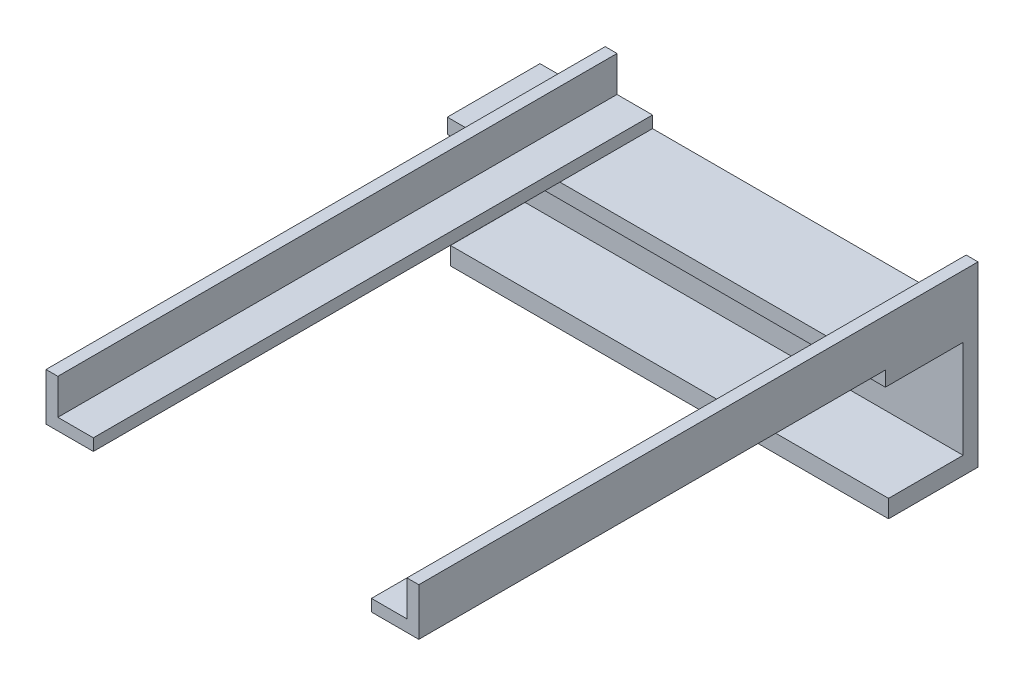
ISO-10303-21;
HEADER;
FILE_DESCRIPTION(('STEP AP214'),'2;1');
FILE_NAME('part.step','',(''),(''),'','','');
FILE_SCHEMA(('AUTOMOTIVE_DESIGN { 1 0 10303 214 1 1 1 1 }'));
ENDSEC;
DATA;
#1=APPLICATION_CONTEXT('core data for automotive mechanical design processes');
#2=APPLICATION_PROTOCOL_DEFINITION('international standard','automotive_design',2000,#1);
#3=PRODUCT_CONTEXT('',#1,'mechanical');
#4=PRODUCT('Part','Part','',(#3));
#5=PRODUCT_RELATED_PRODUCT_CATEGORY('part','',(#4));
#6=PRODUCT_DEFINITION_FORMATION('','',#4);
#7=PRODUCT_DEFINITION_CONTEXT('part definition',#1,'design');
#8=PRODUCT_DEFINITION('design','',#6,#7);
#9=PRODUCT_DEFINITION_SHAPE('','',#8);
#10=(LENGTH_UNIT() NAMED_UNIT(*) SI_UNIT(.MILLI.,.METRE.));
#11=(NAMED_UNIT(*) PLANE_ANGLE_UNIT() SI_UNIT($,.RADIAN.));
#12=(NAMED_UNIT(*) SI_UNIT($,.STERADIAN.) SOLID_ANGLE_UNIT());
#13=UNCERTAINTY_MEASURE_WITH_UNIT(LENGTH_MEASURE(1.E-05),#10,'distance_accuracy_value','');
#14=(GEOMETRIC_REPRESENTATION_CONTEXT(3) GLOBAL_UNCERTAINTY_ASSIGNED_CONTEXT((#13)) GLOBAL_UNIT_ASSIGNED_CONTEXT((#10,
#11,#12)) REPRESENTATION_CONTEXT('',''));
#15=CARTESIAN_POINT('',(0.,0.,0.));
#16=DIRECTION('',(0.,0.,1.));
#17=DIRECTION('',(1.,0.,0.));
#18=AXIS2_PLACEMENT_3D('',#15,#16,#17);
#19=CARTESIAN_POINT('',(0.,0.,8.));
#20=DIRECTION('',(0.,0.,1.));
#21=DIRECTION('',(1.,0.,0.));
#22=AXIS2_PLACEMENT_3D('',#19,#20,#21);
#23=PLANE('',#22);
#24=DIRECTION('',(0.,-1.,0.));
#25=VECTOR('',#24,1.);
#26=CARTESIAN_POINT('',(-117.5,-35.,8.));
#27=LINE('',#26,#25);
#28=CARTESIAN_POINT('',(-117.5,27.,8.));
#29=VERTEX_POINT('',#28);
#30=CARTESIAN_POINT('',(-117.5,-25.475,8.));
#31=VERTEX_POINT('',#30);
#32=EDGE_CURVE('E321',#29,#31,#27,.T.);
#33=ORIENTED_EDGE('',*,*,#32,.T.);
#34=DIRECTION('',(-1.,0.,0.));
#35=VECTOR('',#34,1.);
#36=CARTESIAN_POINT('',(-117.5,-25.475,8.));
#37=LINE('',#36,#35);
#38=CARTESIAN_POINT('',(117.5,-25.475,8.));
#39=VERTEX_POINT('',#38);
#40=EDGE_CURVE('E199',#39,#31,#37,.T.);
#41=ORIENTED_EDGE('',*,*,#40,.F.);
#42=DIRECTION('',(0.,1.,0.));
#43=VECTOR('',#42,1.);
#44=CARTESIAN_POINT('',(117.5,-35.,8.));
#45=LINE('',#44,#43);
#46=CARTESIAN_POINT('',(117.5,27.,8.));
#47=VERTEX_POINT('',#46);
#48=EDGE_CURVE('E324',#39,#47,#45,.T.);
#49=ORIENTED_EDGE('',*,*,#48,.T.);
#50=DIRECTION('',(1.,0.,0.));
#51=VECTOR('',#50,1.);
#52=CARTESIAN_POINT('',(0.,27.,8.));
#53=LINE('',#52,#51);
#54=EDGE_CURVE('E316',#29,#47,#53,.T.);
#55=ORIENTED_EDGE('',*,*,#54,.F.);
#56=EDGE_LOOP('',(#33,#41,#49,#55));
#57=FACE_BOUND('',#56,.T.);
#58=ADVANCED_FACE('F33',(#57),#23,.T.);
#59=CARTESIAN_POINT('',(117.5,35.,8.));
#60=DIRECTION('',(0.,-1.,0.));
#61=DIRECTION('',(1.,0.,0.));
#62=AXIS2_PLACEMENT_3D('',#59,#60,#61);
#63=PLANE('',#62);
#64=DIRECTION('',(-1.,0.,0.));
#65=VECTOR('',#64,1.);
#66=CARTESIAN_POINT('',(117.5,35.,0.));
#67=LINE('',#66,#65);
#68=CARTESIAN_POINT('',(92.1,35.,0.));
#69=VERTEX_POINT('',#68);
#70=CARTESIAN_POINT('',(-57.1,35.,0.));
#71=VERTEX_POINT('',#70);
#72=EDGE_CURVE('E325',#69,#71,#67,.T.);
#73=ORIENTED_EDGE('',*,*,#72,.T.);
#74=DIRECTION('',(0.,0.,-1.));
#75=VECTOR('',#74,1.);
#76=CARTESIAN_POINT('',(-57.1,35.,300.));
#77=LINE('',#76,#75);
#78=CARTESIAN_POINT('',(-57.1,35.,49.6984603780246));
#79=VERTEX_POINT('',#78);
#80=EDGE_CURVE('E228',#79,#71,#77,.T.);
#81=ORIENTED_EDGE('',*,*,#80,.F.);
#82=DIRECTION('',(1.,0.,0.));
#83=VECTOR('',#82,1.);
#84=CARTESIAN_POINT('',(117.5,35.,49.6984603780246));
#85=LINE('',#84,#83);
#86=CARTESIAN_POINT('',(92.1,35.,49.6984603780246));
#87=VERTEX_POINT('',#86);
#88=EDGE_CURVE('E312',#79,#87,#85,.T.);
#89=ORIENTED_EDGE('',*,*,#88,.T.);
#90=DIRECTION('',(0.,0.,-1.));
#91=VECTOR('',#90,1.);
#92=CARTESIAN_POINT('',(92.1,35.,300.));
#93=LINE('',#92,#91);
#94=EDGE_CURVE('E11',#87,#69,#93,.T.);
#95=ORIENTED_EDGE('',*,*,#94,.T.);
#96=EDGE_LOOP('',(#73,#81,#89,#95));
#97=FACE_BOUND('',#96,.T.);
#98=ADVANCED_FACE('F402',(#97),#63,.F.);
#99=CARTESIAN_POINT('',(-117.5,-35.,8.));
#100=DIRECTION('',(1.,0.,0.));
#101=DIRECTION('',(0.,0.,-1.));
#102=AXIS2_PLACEMENT_3D('',#99,#100,#101);
#103=PLANE('',#102);
#104=ORIENTED_EDGE('',*,*,#32,.F.);
#105=DIRECTION('',(0.,0.,1.));
#106=VECTOR('',#105,1.);
#107=CARTESIAN_POINT('',(-117.5,27.,0.));
#108=LINE('',#107,#106);
#109=CARTESIAN_POINT('',(-117.5,27.,49.6984603780246));
#110=VERTEX_POINT('',#109);
#111=EDGE_CURVE('E303',#29,#110,#108,.T.);
#112=ORIENTED_EDGE('',*,*,#111,.T.);
#113=DIRECTION('',(0.,1.,0.));
#114=VECTOR('',#113,1.);
#115=CARTESIAN_POINT('',(-117.5,27.,49.6984603780246));
#116=LINE('',#115,#114);
#117=CARTESIAN_POINT('',(-117.5,35.,49.6984603780246));
#118=VERTEX_POINT('',#117);
#119=EDGE_CURVE('E309',#110,#118,#116,.T.);
#120=ORIENTED_EDGE('',*,*,#119,.T.);
#121=DIRECTION('',(0.,0.,-1.));
#122=VECTOR('',#121,1.);
#123=CARTESIAN_POINT('',(-117.5,35.,8.));
#124=LINE('',#123,#122);
#125=CARTESIAN_POINT('',(-117.5,35.,0.));
#126=VERTEX_POINT('',#125);
#127=EDGE_CURVE('E327',#118,#126,#124,.T.);
#128=ORIENTED_EDGE('',*,*,#127,.T.);
#129=DIRECTION('',(0.,-1.,0.));
#130=VECTOR('',#129,1.);
#131=CARTESIAN_POINT('',(-117.5,-35.,0.));
#132=LINE('',#131,#130);
#133=CARTESIAN_POINT('',(-117.5,-35.,0.));
#134=VERTEX_POINT('',#133);
#135=EDGE_CURVE('E184',#126,#134,#132,.T.);
#136=ORIENTED_EDGE('',*,*,#135,.T.);
#137=DIRECTION('',(0.,0.,-1.));
#138=VECTOR('',#137,1.);
#139=CARTESIAN_POINT('',(-117.5,-35.,8.));
#140=LINE('',#139,#138);
#141=CARTESIAN_POINT('',(-117.5,-35.,48.));
#142=VERTEX_POINT('',#141);
#143=EDGE_CURVE('E37',#142,#134,#140,.T.);
#144=ORIENTED_EDGE('',*,*,#143,.F.);
#145=DIRECTION('',(0.,-1.,0.));
#146=VECTOR('',#145,1.);
#147=CARTESIAN_POINT('',(-117.5,-35.,48.));
#148=LINE('',#147,#146);
#149=CARTESIAN_POINT('',(-117.5,-25.475,48.));
#150=VERTEX_POINT('',#149);
#151=EDGE_CURVE('E181',#150,#142,#148,.T.);
#152=ORIENTED_EDGE('',*,*,#151,.F.);
#153=DIRECTION('',(0.,0.,-1.));
#154=VECTOR('',#153,1.);
#155=CARTESIAN_POINT('',(-117.5,-25.475,48.));
#156=LINE('',#155,#154);
#157=EDGE_CURVE('E204',#150,#31,#156,.T.);
#158=ORIENTED_EDGE('',*,*,#157,.T.);
#159=EDGE_LOOP('',(#104,#112,#120,#128,#136,#144,#152,#158));
#160=FACE_BOUND('',#159,.T.);
#161=ADVANCED_FACE('F35',(#160),#103,.F.);
#162=CARTESIAN_POINT('',(117.5,-35.,8.));
#163=DIRECTION('',(0.,1.,0.));
#164=DIRECTION('',(-1.,0.,0.));
#165=AXIS2_PLACEMENT_3D('',#162,#163,#164);
#166=PLANE('',#165);
#167=DIRECTION('',(1.,0.,0.));
#168=VECTOR('',#167,1.);
#169=CARTESIAN_POINT('',(117.5,-35.,0.));
#170=LINE('',#169,#168);
#171=CARTESIAN_POINT('',(117.5,-35.,0.));
#172=VERTEX_POINT('',#171);
#173=EDGE_CURVE('E329',#134,#172,#170,.T.);
#174=ORIENTED_EDGE('',*,*,#173,.T.);
#175=DIRECTION('',(0.,0.,-1.));
#176=VECTOR('',#175,1.);
#177=CARTESIAN_POINT('',(117.5,-35.,8.));
#178=LINE('',#177,#176);
#179=CARTESIAN_POINT('',(117.5,-35.,48.));
#180=VERTEX_POINT('',#179);
#181=EDGE_CURVE('E187',#180,#172,#178,.T.);
#182=ORIENTED_EDGE('',*,*,#181,.F.);
#183=DIRECTION('',(1.,0.,0.));
#184=VECTOR('',#183,1.);
#185=CARTESIAN_POINT('',(-117.5,-35.,48.));
#186=LINE('',#185,#184);
#187=EDGE_CURVE('E189',#142,#180,#186,.T.);
#188=ORIENTED_EDGE('',*,*,#187,.F.);
#189=ORIENTED_EDGE('',*,*,#143,.T.);
#190=EDGE_LOOP('',(#174,#182,#188,#189));
#191=FACE_BOUND('',#190,.T.);
#192=ADVANCED_FACE('F190',(#191),#166,.F.);
#193=CARTESIAN_POINT('',(117.5,-35.,8.));
#194=DIRECTION('',(-1.,0.,0.));
#195=DIRECTION('',(0.,0.,1.));
#196=AXIS2_PLACEMENT_3D('',#193,#194,#195);
#197=PLANE('',#196);
#198=DIRECTION('',(0.,1.,0.));
#199=VECTOR('',#198,1.);
#200=CARTESIAN_POINT('',(117.5,-35.,0.));
#201=LINE('',#200,#199);
#202=CARTESIAN_POINT('',(117.5,60.4,0.));
#203=VERTEX_POINT('',#202);
#204=EDGE_CURVE('E331',#172,#203,#201,.T.);
#205=ORIENTED_EDGE('',*,*,#204,.T.);
#206=DIRECTION('',(0.,0.,-1.));
#207=VECTOR('',#206,1.);
#208=CARTESIAN_POINT('',(117.5,60.4,300.));
#209=LINE('',#208,#207);
#210=CARTESIAN_POINT('',(117.5,60.4,300.));
#211=VERTEX_POINT('',#210);
#212=EDGE_CURVE('E290',#211,#203,#209,.T.);
#213=ORIENTED_EDGE('',*,*,#212,.F.);
#214=DIRECTION('',(0.,-1.,0.));
#215=VECTOR('',#214,1.);
#216=CARTESIAN_POINT('',(117.5,35.,300.));
#217=LINE('',#216,#215);
#218=CARTESIAN_POINT('',(117.5,35.,300.));
#219=VERTEX_POINT('',#218);
#220=EDGE_CURVE('E273',#211,#219,#217,.T.);
#221=ORIENTED_EDGE('',*,*,#220,.T.);
#222=DIRECTION('',(0.,0.,-1.));
#223=VECTOR('',#222,1.);
#224=CARTESIAN_POINT('',(117.5,35.,300.));
#225=LINE('',#224,#223);
#226=CARTESIAN_POINT('',(117.5,35.,49.6984603780246));
#227=VERTEX_POINT('',#226);
#228=EDGE_CURVE('E286',#219,#227,#225,.T.);
#229=ORIENTED_EDGE('',*,*,#228,.T.);
#230=DIRECTION('',(0.,1.,0.));
#231=VECTOR('',#230,1.);
#232=CARTESIAN_POINT('',(117.5,27.,49.6984603780246));
#233=LINE('',#232,#231);
#234=CARTESIAN_POINT('',(117.5,27.,49.6984603780246));
#235=VERTEX_POINT('',#234);
#236=EDGE_CURVE('E313',#235,#227,#233,.T.);
#237=ORIENTED_EDGE('',*,*,#236,.F.);
#238=DIRECTION('',(0.,0.,-1.));
#239=VECTOR('',#238,1.);
#240=CARTESIAN_POINT('',(117.5,27.,0.));
#241=LINE('',#240,#239);
#242=EDGE_CURVE('E300',#235,#47,#241,.T.);
#243=ORIENTED_EDGE('',*,*,#242,.T.);
#244=ORIENTED_EDGE('',*,*,#48,.F.);
#245=DIRECTION('',(0.,0.,-1.));
#246=VECTOR('',#245,1.);
#247=CARTESIAN_POINT('',(117.5,-25.475,48.));
#248=LINE('',#247,#246);
#249=CARTESIAN_POINT('',(117.5,-25.475,48.));
#250=VERTEX_POINT('',#249);
#251=EDGE_CURVE('E50',#250,#39,#248,.T.);
#252=ORIENTED_EDGE('',*,*,#251,.F.);
#253=DIRECTION('',(0.,1.,0.));
#254=VECTOR('',#253,1.);
#255=CARTESIAN_POINT('',(117.5,-35.,48.));
#256=LINE('',#255,#254);
#257=EDGE_CURVE('E194',#180,#250,#256,.T.);
#258=ORIENTED_EDGE('',*,*,#257,.F.);
#259=ORIENTED_EDGE('',*,*,#181,.T.);
#260=EDGE_LOOP('',(#205,#213,#221,#229,#237,#243,#244,#252,#258,#259));
#261=FACE_BOUND('',#260,.T.);
#262=ADVANCED_FACE('F337',(#261),#197,.F.);
#263=CARTESIAN_POINT('',(-82.5,35.,49.6984603780246));
#264=VERTEX_POINT('',#263);
#265=EDGE_CURVE('E304',#118,#264,#85,.T.);
#266=ORIENTED_EDGE('',*,*,#265,.T.);
#267=DIRECTION('',(0.,0.,-1.));
#268=VECTOR('',#267,1.);
#269=CARTESIAN_POINT('',(-82.5,35.,300.));
#270=LINE('',#269,#268);
#271=CARTESIAN_POINT('',(-82.5,35.,0.));
#272=VERTEX_POINT('',#271);
#273=EDGE_CURVE('E58',#264,#272,#270,.T.);
#274=ORIENTED_EDGE('',*,*,#273,.T.);
#275=EDGE_CURVE('E333',#272,#126,#67,.T.);
#276=ORIENTED_EDGE('',*,*,#275,.T.);
#277=ORIENTED_EDGE('',*,*,#127,.F.);
#278=EDGE_LOOP('',(#266,#274,#276,#277));
#279=FACE_BOUND('',#278,.T.);
#280=ADVANCED_FACE('F385',(#279),#63,.F.);
#281=CARTESIAN_POINT('',(0.,0.,0.));
#282=DIRECTION('',(0.,0.,1.));
#283=DIRECTION('',(1.,0.,0.));
#284=AXIS2_PLACEMENT_3D('',#281,#282,#283);
#285=PLANE('',#284);
#286=ORIENTED_EDGE('',*,*,#173,.F.);
#287=ORIENTED_EDGE('',*,*,#135,.F.);
#288=ORIENTED_EDGE('',*,*,#275,.F.);
#289=DIRECTION('',(0.,1.,0.));
#290=VECTOR('',#289,1.);
#291=CARTESIAN_POINT('',(-82.5,35.,0.));
#292=LINE('',#291,#290);
#293=CARTESIAN_POINT('',(-82.5,60.4000000000001,0.));
#294=VERTEX_POINT('',#293);
#295=EDGE_CURVE('E231',#272,#294,#292,.T.);
#296=ORIENTED_EDGE('',*,*,#295,.T.);
#297=DIRECTION('',(1.,0.,0.));
#298=VECTOR('',#297,1.);
#299=CARTESIAN_POINT('',(-82.5,60.4000000000001,0.));
#300=LINE('',#299,#298);
#301=CARTESIAN_POINT('',(-76.15,60.4000000000001,0.));
#302=VERTEX_POINT('',#301);
#303=EDGE_CURVE('E234',#294,#302,#300,.T.);
#304=ORIENTED_EDGE('',*,*,#303,.T.);
#305=DIRECTION('',(0.,-1.,0.));
#306=VECTOR('',#305,1.);
#307=CARTESIAN_POINT('',(-76.15,60.4000000000001,0.));
#308=LINE('',#307,#306);
#309=CARTESIAN_POINT('',(-76.15,41.3500000000001,0.));
#310=VERTEX_POINT('',#309);
#311=EDGE_CURVE('E237',#302,#310,#308,.T.);
#312=ORIENTED_EDGE('',*,*,#311,.T.);
#313=DIRECTION('',(1.,0.,0.));
#314=VECTOR('',#313,1.);
#315=CARTESIAN_POINT('',(-76.15,41.3500000000001,0.));
#316=LINE('',#315,#314);
#317=CARTESIAN_POINT('',(-57.1,41.3500000000001,0.));
#318=VERTEX_POINT('',#317);
#319=EDGE_CURVE('E213',#310,#318,#316,.T.);
#320=ORIENTED_EDGE('',*,*,#319,.T.);
#321=DIRECTION('',(0.,-1.,0.));
#322=VECTOR('',#321,1.);
#323=CARTESIAN_POINT('',(-57.1,41.3500000000001,0.));
#324=LINE('',#323,#322);
#325=EDGE_CURVE('E208',#318,#71,#324,.T.);
#326=ORIENTED_EDGE('',*,*,#325,.T.);
#327=ORIENTED_EDGE('',*,*,#72,.F.);
#328=DIRECTION('',(0.,1.,0.));
#329=VECTOR('',#328,1.);
#330=CARTESIAN_POINT('',(92.1,41.35,0.));
#331=LINE('',#330,#329);
#332=CARTESIAN_POINT('',(92.1,41.35,0.));
#333=VERTEX_POINT('',#332);
#334=EDGE_CURVE('E244',#69,#333,#331,.T.);
#335=ORIENTED_EDGE('',*,*,#334,.T.);
#336=DIRECTION('',(1.,0.,0.));
#337=VECTOR('',#336,1.);
#338=CARTESIAN_POINT('',(111.15,41.35,0.));
#339=LINE('',#338,#337);
#340=CARTESIAN_POINT('',(111.15,41.35,0.));
#341=VERTEX_POINT('',#340);
#342=EDGE_CURVE('E278',#333,#341,#339,.T.);
#343=ORIENTED_EDGE('',*,*,#342,.T.);
#344=DIRECTION('',(0.,1.,0.));
#345=VECTOR('',#344,1.);
#346=CARTESIAN_POINT('',(111.15,60.4,0.));
#347=LINE('',#346,#345);
#348=CARTESIAN_POINT('',(111.15,60.4,0.));
#349=VERTEX_POINT('',#348);
#350=EDGE_CURVE('E281',#341,#349,#347,.T.);
#351=ORIENTED_EDGE('',*,*,#350,.T.);
#352=DIRECTION('',(1.,0.,0.));
#353=VECTOR('',#352,1.);
#354=CARTESIAN_POINT('',(117.5,60.4,0.));
#355=LINE('',#354,#353);
#356=EDGE_CURVE('E261',#349,#203,#355,.T.);
#357=ORIENTED_EDGE('',*,*,#356,.T.);
#358=ORIENTED_EDGE('',*,*,#204,.F.);
#359=EDGE_LOOP('',(#286,#287,#288,#296,#304,#312,#320,#326,#327,#335,#343,#351,#357,#358));
#360=FACE_BOUND('',#359,.T.);
#361=ADVANCED_FACE('F339',(#360),#285,.F.);
#362=CARTESIAN_POINT('',(117.5,27.,49.6984603780246));
#363=DIRECTION('',(0.,0.,1.));
#364=DIRECTION('',(1.,0.,0.));
#365=AXIS2_PLACEMENT_3D('',#362,#363,#364);
#366=PLANE('',#365);
#367=ORIENTED_EDGE('',*,*,#265,.F.);
#368=ORIENTED_EDGE('',*,*,#119,.F.);
#369=DIRECTION('',(1.,0.,0.));
#370=VECTOR('',#369,1.);
#371=CARTESIAN_POINT('',(117.5,27.,49.6984603780246));
#372=LINE('',#371,#370);
#373=EDGE_CURVE('E306',#110,#235,#372,.T.);
#374=ORIENTED_EDGE('',*,*,#373,.T.);
#375=ORIENTED_EDGE('',*,*,#236,.T.);
#376=EDGE_CURVE('E289',#87,#227,#85,.T.);
#377=ORIENTED_EDGE('',*,*,#376,.F.);
#378=ORIENTED_EDGE('',*,*,#88,.F.);
#379=EDGE_CURVE('E311',#264,#79,#85,.T.);
#380=ORIENTED_EDGE('',*,*,#379,.F.);
#381=EDGE_LOOP('',(#367,#368,#374,#375,#377,#378,#380));
#382=FACE_BOUND('',#381,.T.);
#383=ADVANCED_FACE('F389',(#382),#366,.T.);
#384=CARTESIAN_POINT('',(0.,27.,0.));
#385=DIRECTION('',(0.,-1.,0.));
#386=DIRECTION('',(1.,0.,0.));
#387=AXIS2_PLACEMENT_3D('',#384,#385,#386);
#388=PLANE('',#387);
#389=ORIENTED_EDGE('',*,*,#111,.F.);
#390=ORIENTED_EDGE('',*,*,#54,.T.);
#391=ORIENTED_EDGE('',*,*,#242,.F.);
#392=ORIENTED_EDGE('',*,*,#373,.F.);
#393=EDGE_LOOP('',(#389,#390,#391,#392));
#394=FACE_BOUND('',#393,.T.);
#395=ADVANCED_FACE('F391',(#394),#388,.T.);
#396=CARTESIAN_POINT('',(92.1,35.,300.));
#397=DIRECTION('',(0.,-1.,0.));
#398=DIRECTION('',(1.,0.,0.));
#399=AXIS2_PLACEMENT_3D('',#396,#397,#398);
#400=PLANE('',#399);
#401=CARTESIAN_POINT('',(92.1,35.,300.));
#402=VERTEX_POINT('',#401);
#403=EDGE_CURVE('E43',#402,#87,#93,.T.);
#404=ORIENTED_EDGE('',*,*,#403,.T.);
#405=ORIENTED_EDGE('',*,*,#376,.T.);
#406=ORIENTED_EDGE('',*,*,#228,.F.);
#407=DIRECTION('',(-1.,0.,0.));
#408=VECTOR('',#407,1.);
#409=CARTESIAN_POINT('',(92.1,35.,300.));
#410=LINE('',#409,#408);
#411=EDGE_CURVE('E257',#219,#402,#410,.T.);
#412=ORIENTED_EDGE('',*,*,#411,.T.);
#413=EDGE_LOOP('',(#404,#405,#406,#412));
#414=FACE_BOUND('',#413,.T.);
#415=ADVANCED_FACE('F353',(#414),#400,.T.);
#416=CARTESIAN_POINT('',(117.5,60.4,300.));
#417=DIRECTION('',(0.,1.,0.));
#418=DIRECTION('',(0.,0.,1.));
#419=AXIS2_PLACEMENT_3D('',#416,#417,#418);
#420=PLANE('',#419);
#421=ORIENTED_EDGE('',*,*,#356,.F.);
#422=DIRECTION('',(0.,0.,-1.));
#423=VECTOR('',#422,1.);
#424=CARTESIAN_POINT('',(111.15,60.4,300.));
#425=LINE('',#424,#423);
#426=CARTESIAN_POINT('',(111.15,60.4,300.));
#427=VERTEX_POINT('',#426);
#428=EDGE_CURVE('E293',#427,#349,#425,.T.);
#429=ORIENTED_EDGE('',*,*,#428,.F.);
#430=DIRECTION('',(1.,0.,0.));
#431=VECTOR('',#430,1.);
#432=CARTESIAN_POINT('',(117.5,60.4,300.));
#433=LINE('',#432,#431);
#434=EDGE_CURVE('E270',#427,#211,#433,.T.);
#435=ORIENTED_EDGE('',*,*,#434,.T.);
#436=ORIENTED_EDGE('',*,*,#212,.T.);
#437=EDGE_LOOP('',(#421,#429,#435,#436));
#438=FACE_BOUND('',#437,.T.);
#439=ADVANCED_FACE('F343',(#438),#420,.T.);
#440=CARTESIAN_POINT('',(111.15,60.4,300.));
#441=DIRECTION('',(-1.,0.,0.));
#442=DIRECTION('',(0.,0.,1.));
#443=AXIS2_PLACEMENT_3D('',#440,#441,#442);
#444=PLANE('',#443);
#445=ORIENTED_EDGE('',*,*,#350,.F.);
#446=DIRECTION('',(0.,0.,-1.));
#447=VECTOR('',#446,1.);
#448=CARTESIAN_POINT('',(111.15,41.35,300.));
#449=LINE('',#448,#447);
#450=CARTESIAN_POINT('',(111.15,41.35,300.));
#451=VERTEX_POINT('',#450);
#452=EDGE_CURVE('E295',#451,#341,#449,.T.);
#453=ORIENTED_EDGE('',*,*,#452,.F.);
#454=DIRECTION('',(0.,1.,0.));
#455=VECTOR('',#454,1.);
#456=CARTESIAN_POINT('',(111.15,60.4,300.));
#457=LINE('',#456,#455);
#458=EDGE_CURVE('E267',#451,#427,#457,.T.);
#459=ORIENTED_EDGE('',*,*,#458,.T.);
#460=ORIENTED_EDGE('',*,*,#428,.T.);
#461=EDGE_LOOP('',(#445,#453,#459,#460));
#462=FACE_BOUND('',#461,.T.);
#463=ADVANCED_FACE('F463',(#462),#444,.T.);
#464=CARTESIAN_POINT('',(111.15,41.35,300.));
#465=DIRECTION('',(0.,1.,0.));
#466=DIRECTION('',(0.,0.,1.));
#467=AXIS2_PLACEMENT_3D('',#464,#465,#466);
#468=PLANE('',#467);
#469=ORIENTED_EDGE('',*,*,#342,.F.);
#470=DIRECTION('',(0.,0.,-1.));
#471=VECTOR('',#470,1.);
#472=CARTESIAN_POINT('',(92.1,41.35,300.));
#473=LINE('',#472,#471);
#474=CARTESIAN_POINT('',(92.1,41.35,300.));
#475=VERTEX_POINT('',#474);
#476=EDGE_CURVE('E297',#475,#333,#473,.T.);
#477=ORIENTED_EDGE('',*,*,#476,.F.);
#478=DIRECTION('',(1.,0.,0.));
#479=VECTOR('',#478,1.);
#480=CARTESIAN_POINT('',(111.15,41.35,300.));
#481=LINE('',#480,#479);
#482=EDGE_CURVE('E264',#475,#451,#481,.T.);
#483=ORIENTED_EDGE('',*,*,#482,.T.);
#484=ORIENTED_EDGE('',*,*,#452,.T.);
#485=EDGE_LOOP('',(#469,#477,#483,#484));
#486=FACE_BOUND('',#485,.T.);
#487=ADVANCED_FACE('F472',(#486),#468,.T.);
#488=CARTESIAN_POINT('',(92.1,41.35,300.));
#489=DIRECTION('',(-1.,0.,0.));
#490=DIRECTION('',(0.,0.,1.));
#491=AXIS2_PLACEMENT_3D('',#488,#489,#490);
#492=PLANE('',#491);
#493=ORIENTED_EDGE('',*,*,#334,.F.);
#494=ORIENTED_EDGE('',*,*,#94,.F.);
#495=ORIENTED_EDGE('',*,*,#403,.F.);
#496=DIRECTION('',(0.,1.,0.));
#497=VECTOR('',#496,1.);
#498=CARTESIAN_POINT('',(92.1,41.35,300.));
#499=LINE('',#498,#497);
#500=EDGE_CURVE('E260',#402,#475,#499,.T.);
#501=ORIENTED_EDGE('',*,*,#500,.T.);
#502=ORIENTED_EDGE('',*,*,#476,.T.);
#503=EDGE_LOOP('',(#493,#494,#495,#501,#502));
#504=FACE_BOUND('',#503,.T.);
#505=ADVANCED_FACE('F482',(#504),#492,.T.);
#506=CARTESIAN_POINT('',(0.,0.,300.));
#507=DIRECTION('',(0.,0.,1.));
#508=DIRECTION('',(1.,0.,0.));
#509=AXIS2_PLACEMENT_3D('',#506,#507,#508);
#510=PLANE('',#509);
#511=ORIENTED_EDGE('',*,*,#411,.F.);
#512=ORIENTED_EDGE('',*,*,#220,.F.);
#513=ORIENTED_EDGE('',*,*,#434,.F.);
#514=ORIENTED_EDGE('',*,*,#458,.F.);
#515=ORIENTED_EDGE('',*,*,#482,.F.);
#516=ORIENTED_EDGE('',*,*,#500,.F.);
#517=EDGE_LOOP('',(#511,#512,#513,#514,#515,#516));
#518=FACE_BOUND('',#517,.T.);
#519=ADVANCED_FACE('F348',(#518),#510,.T.);
#520=CARTESIAN_POINT('',(-57.1,41.3500000000001,300.));
#521=DIRECTION('',(1.,0.,0.));
#522=DIRECTION('',(0.,0.,-1.));
#523=AXIS2_PLACEMENT_3D('',#520,#521,#522);
#524=PLANE('',#523);
#525=ORIENTED_EDGE('',*,*,#325,.F.);
#526=DIRECTION('',(0.,0.,-1.));
#527=VECTOR('',#526,1.);
#528=CARTESIAN_POINT('',(-57.1,41.3500000000001,300.));
#529=LINE('',#528,#527);
#530=CARTESIAN_POINT('',(-57.1,41.3500000000001,300.));
#531=VERTEX_POINT('',#530);
#532=EDGE_CURVE('E242',#531,#318,#529,.T.);
#533=ORIENTED_EDGE('',*,*,#532,.F.);
#534=DIRECTION('',(0.,-1.,0.));
#535=VECTOR('',#534,1.);
#536=CARTESIAN_POINT('',(-57.1,41.3500000000001,300.));
#537=LINE('',#536,#535);
#538=CARTESIAN_POINT('',(-57.1,35.,300.));
#539=VERTEX_POINT('',#538);
#540=EDGE_CURVE('E209',#531,#539,#537,.T.);
#541=ORIENTED_EDGE('',*,*,#540,.T.);
#542=EDGE_CURVE('E254',#539,#79,#77,.T.);
#543=ORIENTED_EDGE('',*,*,#542,.T.);
#544=ORIENTED_EDGE('',*,*,#80,.T.);
#545=EDGE_LOOP('',(#525,#533,#541,#543,#544));
#546=FACE_BOUND('',#545,.T.);
#547=ADVANCED_FACE('F364',(#546),#524,.T.);
#548=CARTESIAN_POINT('',(-76.15,41.3500000000001,300.));
#549=DIRECTION('',(0.,1.,0.));
#550=DIRECTION('',(0.,0.,1.));
#551=AXIS2_PLACEMENT_3D('',#548,#549,#550);
#552=PLANE('',#551);
#553=ORIENTED_EDGE('',*,*,#319,.F.);
#554=DIRECTION('',(0.,0.,-1.));
#555=VECTOR('',#554,1.);
#556=CARTESIAN_POINT('',(-76.15,41.3500000000001,300.));
#557=LINE('',#556,#555);
#558=CARTESIAN_POINT('',(-76.15,41.3500000000001,300.));
#559=VERTEX_POINT('',#558);
#560=EDGE_CURVE('E245',#559,#310,#557,.T.);
#561=ORIENTED_EDGE('',*,*,#560,.F.);
#562=DIRECTION('',(1.,0.,0.));
#563=VECTOR('',#562,1.);
#564=CARTESIAN_POINT('',(-76.15,41.3500000000001,300.));
#565=LINE('',#564,#563);
#566=EDGE_CURVE('E225',#559,#531,#565,.T.);
#567=ORIENTED_EDGE('',*,*,#566,.T.);
#568=ORIENTED_EDGE('',*,*,#532,.T.);
#569=EDGE_LOOP('',(#553,#561,#567,#568));
#570=FACE_BOUND('',#569,.T.);
#571=ADVANCED_FACE('F374',(#570),#552,.T.);
#572=CARTESIAN_POINT('',(-76.15,60.4000000000001,300.));
#573=DIRECTION('',(1.,0.,0.));
#574=DIRECTION('',(0.,0.,-1.));
#575=AXIS2_PLACEMENT_3D('',#572,#573,#574);
#576=PLANE('',#575);
#577=ORIENTED_EDGE('',*,*,#311,.F.);
#578=DIRECTION('',(0.,0.,-1.));
#579=VECTOR('',#578,1.);
#580=CARTESIAN_POINT('',(-76.15,60.4000000000001,300.));
#581=LINE('',#580,#579);
#582=CARTESIAN_POINT('',(-76.15,60.4000000000001,300.));
#583=VERTEX_POINT('',#582);
#584=EDGE_CURVE('E247',#583,#302,#581,.T.);
#585=ORIENTED_EDGE('',*,*,#584,.F.);
#586=DIRECTION('',(0.,-1.,0.));
#587=VECTOR('',#586,1.);
#588=CARTESIAN_POINT('',(-76.15,60.4000000000001,300.));
#589=LINE('',#588,#587);
#590=EDGE_CURVE('E222',#583,#559,#589,.T.);
#591=ORIENTED_EDGE('',*,*,#590,.T.);
#592=ORIENTED_EDGE('',*,*,#560,.T.);
#593=EDGE_LOOP('',(#577,#585,#591,#592));
#594=FACE_BOUND('',#593,.T.);
#595=ADVANCED_FACE('F377',(#594),#576,.T.);
#596=CARTESIAN_POINT('',(-82.5,60.4000000000001,300.));
#597=DIRECTION('',(0.,1.,0.));
#598=DIRECTION('',(0.,0.,1.));
#599=AXIS2_PLACEMENT_3D('',#596,#597,#598);
#600=PLANE('',#599);
#601=ORIENTED_EDGE('',*,*,#303,.F.);
#602=DIRECTION('',(0.,0.,-1.));
#603=VECTOR('',#602,1.);
#604=CARTESIAN_POINT('',(-82.5,60.4000000000001,300.));
#605=LINE('',#604,#603);
#606=CARTESIAN_POINT('',(-82.5,60.4000000000001,300.));
#607=VERTEX_POINT('',#606);
#608=EDGE_CURVE('E249',#607,#294,#605,.T.);
#609=ORIENTED_EDGE('',*,*,#608,.F.);
#610=DIRECTION('',(1.,0.,0.));
#611=VECTOR('',#610,1.);
#612=CARTESIAN_POINT('',(-82.5,60.4000000000001,300.));
#613=LINE('',#612,#611);
#614=EDGE_CURVE('E219',#607,#583,#613,.T.);
#615=ORIENTED_EDGE('',*,*,#614,.T.);
#616=ORIENTED_EDGE('',*,*,#584,.T.);
#617=EDGE_LOOP('',(#601,#609,#615,#616));
#618=FACE_BOUND('',#617,.T.);
#619=ADVANCED_FACE('F381',(#618),#600,.T.);
#620=CARTESIAN_POINT('',(-82.5,35.,300.));
#621=DIRECTION('',(-1.,0.,0.));
#622=DIRECTION('',(0.,0.,1.));
#623=AXIS2_PLACEMENT_3D('',#620,#621,#622);
#624=PLANE('',#623);
#625=ORIENTED_EDGE('',*,*,#295,.F.);
#626=ORIENTED_EDGE('',*,*,#273,.F.);
#627=CARTESIAN_POINT('',(-82.5,35.,300.));
#628=VERTEX_POINT('',#627);
#629=EDGE_CURVE('E251',#628,#264,#270,.T.);
#630=ORIENTED_EDGE('',*,*,#629,.F.);
#631=DIRECTION('',(0.,1.,0.));
#632=VECTOR('',#631,1.);
#633=CARTESIAN_POINT('',(-82.5,35.,300.));
#634=LINE('',#633,#632);
#635=EDGE_CURVE('E216',#628,#607,#634,.T.);
#636=ORIENTED_EDGE('',*,*,#635,.T.);
#637=ORIENTED_EDGE('',*,*,#608,.T.);
#638=EDGE_LOOP('',(#625,#626,#630,#636,#637));
#639=FACE_BOUND('',#638,.T.);
#640=ADVANCED_FACE('F384',(#639),#624,.T.);
#641=CARTESIAN_POINT('',(-57.1,35.,300.));
#642=DIRECTION('',(0.,-1.,0.));
#643=DIRECTION('',(0.,0.,-1.));
#644=AXIS2_PLACEMENT_3D('',#641,#642,#643);
#645=PLANE('',#644);
#646=ORIENTED_EDGE('',*,*,#629,.T.);
#647=ORIENTED_EDGE('',*,*,#379,.T.);
#648=ORIENTED_EDGE('',*,*,#542,.F.);
#649=DIRECTION('',(-1.,0.,0.));
#650=VECTOR('',#649,1.);
#651=CARTESIAN_POINT('',(-57.1,35.,300.));
#652=LINE('',#651,#650);
#653=EDGE_CURVE('E212',#539,#628,#652,.T.);
#654=ORIENTED_EDGE('',*,*,#653,.T.);
#655=EDGE_LOOP('',(#646,#647,#648,#654));
#656=FACE_BOUND('',#655,.T.);
#657=ADVANCED_FACE('F358',(#656),#645,.T.);
#658=CARTESIAN_POINT('',(0.,0.,300.));
#659=DIRECTION('',(0.,0.,-1.));
#660=DIRECTION('',(-1.,0.,0.));
#661=AXIS2_PLACEMENT_3D('',#658,#659,#660);
#662=PLANE('',#661);
#663=ORIENTED_EDGE('',*,*,#540,.F.);
#664=ORIENTED_EDGE('',*,*,#566,.F.);
#665=ORIENTED_EDGE('',*,*,#590,.F.);
#666=ORIENTED_EDGE('',*,*,#614,.F.);
#667=ORIENTED_EDGE('',*,*,#635,.F.);
#668=ORIENTED_EDGE('',*,*,#653,.F.);
#669=EDGE_LOOP('',(#663,#664,#665,#666,#667,#668));
#670=FACE_BOUND('',#669,.T.);
#671=ADVANCED_FACE('F369',(#670),#662,.F.);
#672=CARTESIAN_POINT('',(-117.5,-25.475,48.));
#673=DIRECTION('',(0.,-1.,0.));
#674=DIRECTION('',(0.,0.,-1.));
#675=AXIS2_PLACEMENT_3D('',#672,#673,#674);
#676=PLANE('',#675);
#677=ORIENTED_EDGE('',*,*,#40,.T.);
#678=ORIENTED_EDGE('',*,*,#157,.F.);
#679=DIRECTION('',(-1.,0.,0.));
#680=VECTOR('',#679,1.);
#681=CARTESIAN_POINT('',(-117.5,-25.475,48.));
#682=LINE('',#681,#680);
#683=EDGE_CURVE('E197',#250,#150,#682,.T.);
#684=ORIENTED_EDGE('',*,*,#683,.F.);
#685=ORIENTED_EDGE('',*,*,#251,.T.);
#686=EDGE_LOOP('',(#677,#678,#684,#685));
#687=FACE_BOUND('',#686,.T.);
#688=ADVANCED_FACE('F556',(#687),#676,.F.);
#689=CARTESIAN_POINT('',(0.,0.,48.));
#690=DIRECTION('',(0.,0.,-1.));
#691=DIRECTION('',(-1.,0.,0.));
#692=AXIS2_PLACEMENT_3D('',#689,#690,#691);
#693=PLANE('',#692);
#694=ORIENTED_EDGE('',*,*,#151,.T.);
#695=ORIENTED_EDGE('',*,*,#187,.T.);
#696=ORIENTED_EDGE('',*,*,#257,.T.);
#697=ORIENTED_EDGE('',*,*,#683,.T.);
#698=EDGE_LOOP('',(#694,#695,#696,#697));
#699=FACE_BOUND('',#698,.T.);
#700=ADVANCED_FACE('F196',(#699),#693,.F.);
#701=CLOSED_SHELL('',(#58,#98,#161,#192,#262,#280,#361,#383,#395,#415,#439,#463,#487,#505,#519,
#547,#571,#595,#619,#640,#657,#671,#688,#700));
#702=MANIFOLD_SOLID_BREP('B2',#701);
#703=ADVANCED_BREP_SHAPE_REPRESENTATION('',(#18,#702),#14);
#704=SHAPE_DEFINITION_REPRESENTATION(#9,#703);
ENDSEC;
END-ISO-10303-21;
